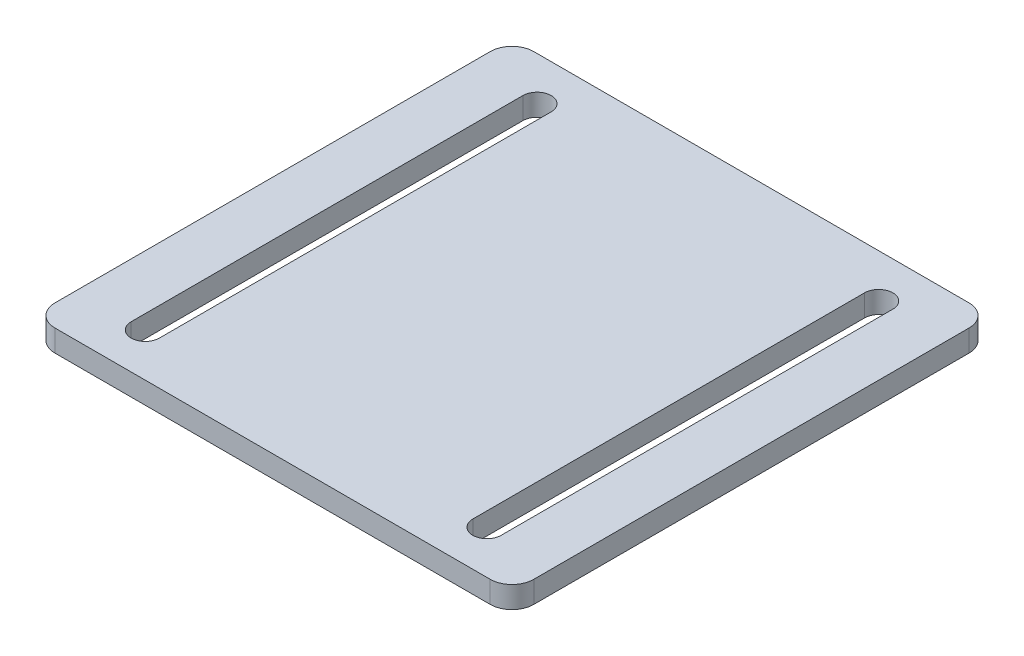
ISO-10303-21;
HEADER;
FILE_DESCRIPTION(('STEP AP214'),'2;1');
FILE_NAME('part.step','',(''),(''),'','','');
FILE_SCHEMA(('AUTOMOTIVE_DESIGN { 1 0 10303 214 1 1 1 1 }'));
ENDSEC;
DATA;
#1=APPLICATION_CONTEXT('core data for automotive mechanical design processes');
#2=APPLICATION_PROTOCOL_DEFINITION('international standard','automotive_design',2000,#1);
#3=PRODUCT_CONTEXT('',#1,'mechanical');
#4=PRODUCT('Part','Part','',(#3));
#5=PRODUCT_RELATED_PRODUCT_CATEGORY('part','',(#4));
#6=PRODUCT_DEFINITION_FORMATION('','',#4);
#7=PRODUCT_DEFINITION_CONTEXT('part definition',#1,'design');
#8=PRODUCT_DEFINITION('design','',#6,#7);
#9=PRODUCT_DEFINITION_SHAPE('','',#8);
#10=(LENGTH_UNIT() NAMED_UNIT(*) SI_UNIT(.MILLI.,.METRE.));
#11=(NAMED_UNIT(*) PLANE_ANGLE_UNIT() SI_UNIT($,.RADIAN.));
#12=(NAMED_UNIT(*) SI_UNIT($,.STERADIAN.) SOLID_ANGLE_UNIT());
#13=UNCERTAINTY_MEASURE_WITH_UNIT(LENGTH_MEASURE(1.E-05),#10,'distance_accuracy_value','');
#14=(GEOMETRIC_REPRESENTATION_CONTEXT(3) GLOBAL_UNCERTAINTY_ASSIGNED_CONTEXT((#13)) GLOBAL_UNIT_ASSIGNED_CONTEXT((#10,
#11,#12)) REPRESENTATION_CONTEXT('',''));
#15=CARTESIAN_POINT('',(0.,0.,0.));
#16=DIRECTION('',(0.,0.,1.));
#17=DIRECTION('',(1.,0.,0.));
#18=AXIS2_PLACEMENT_3D('',#15,#16,#17);
#19=CARTESIAN_POINT('',(-25.4,2.54,-25.4));
#20=DIRECTION('',(0.,-1.,0.));
#21=DIRECTION('',(0.,0.,-1.));
#22=AXIS2_PLACEMENT_3D('',#19,#20,#21);
#23=PLANE('',#22);
#24=CARTESIAN_POINT('',(-19.939,2.54,-22.86));
#25=DIRECTION('',(0.,1.,0.));
#26=DIRECTION('',(0.,0.,1.));
#27=AXIS2_PLACEMENT_3D('',#24,#25,#26);
#28=CIRCLE('',#27,1.651);
#29=CARTESIAN_POINT('',(-18.288,2.54,-22.86));
#30=VERTEX_POINT('',#29);
#31=CARTESIAN_POINT('',(-21.59,2.54,-22.86));
#32=VERTEX_POINT('',#31);
#33=EDGE_CURVE('E182',#30,#32,#28,.T.);
#34=ORIENTED_EDGE('',*,*,#33,.F.);
#35=DIRECTION('',(0.,0.,-1.));
#36=VECTOR('',#35,1.);
#37=CARTESIAN_POINT('',(-18.288,2.54,-22.86));
#38=LINE('',#37,#36);
#39=CARTESIAN_POINT('',(-18.288,2.54,22.86));
#40=VERTEX_POINT('',#39);
#41=EDGE_CURVE('E190',#40,#30,#38,.T.);
#42=ORIENTED_EDGE('',*,*,#41,.F.);
#43=CARTESIAN_POINT('',(-19.939,2.54,22.86));
#44=DIRECTION('',(0.,1.,0.));
#45=DIRECTION('',(0.,0.,1.));
#46=AXIS2_PLACEMENT_3D('',#43,#44,#45);
#47=CIRCLE('',#46,1.651);
#48=CARTESIAN_POINT('',(-21.59,2.54,22.86));
#49=VERTEX_POINT('',#48);
#50=EDGE_CURVE('E187',#49,#40,#47,.T.);
#51=ORIENTED_EDGE('',*,*,#50,.F.);
#52=DIRECTION('',(0.,0.,1.));
#53=VECTOR('',#52,1.);
#54=CARTESIAN_POINT('',(-21.59,2.54,-22.86));
#55=LINE('',#54,#53);
#56=EDGE_CURVE('E184',#32,#49,#55,.T.);
#57=ORIENTED_EDGE('',*,*,#56,.F.);
#58=EDGE_LOOP('',(#34,#42,#51,#57));
#59=FACE_BOUND('',#58,.T.);
#60=DIRECTION('',(0.,0.,1.));
#61=VECTOR('',#60,1.);
#62=CARTESIAN_POINT('',(-27.94,2.54,25.4));
#63=LINE('',#62,#61);
#64=CARTESIAN_POINT('',(-27.94,2.54,-25.4));
#65=VERTEX_POINT('',#64);
#66=CARTESIAN_POINT('',(-27.94,2.54,25.4));
#67=VERTEX_POINT('',#66);
#68=EDGE_CURVE('E213',#65,#67,#63,.T.);
#69=ORIENTED_EDGE('',*,*,#68,.T.);
#70=CARTESIAN_POINT('',(-25.4,2.54,25.4));
#71=DIRECTION('',(0.,1.,0.));
#72=DIRECTION('',(0.,0.,-1.));
#73=AXIS2_PLACEMENT_3D('',#70,#71,#72);
#74=CIRCLE('',#73,2.54);
#75=CARTESIAN_POINT('',(-25.4,2.54,27.94));
#76=VERTEX_POINT('',#75);
#77=EDGE_CURVE('E216',#67,#76,#74,.T.);
#78=ORIENTED_EDGE('',*,*,#77,.T.);
#79=DIRECTION('',(1.,0.,0.));
#80=VECTOR('',#79,1.);
#81=CARTESIAN_POINT('',(0.,2.54,27.94));
#82=LINE('',#81,#80);
#83=CARTESIAN_POINT('',(25.4,2.54,27.94));
#84=VERTEX_POINT('',#83);
#85=EDGE_CURVE('E219',#76,#84,#82,.T.);
#86=ORIENTED_EDGE('',*,*,#85,.T.);
#87=CARTESIAN_POINT('',(25.4,2.54,25.4));
#88=DIRECTION('',(0.,1.,0.));
#89=DIRECTION('',(0.,0.,-1.));
#90=AXIS2_PLACEMENT_3D('',#87,#88,#89);
#91=CIRCLE('',#90,2.54);
#92=CARTESIAN_POINT('',(27.94,2.54,25.4));
#93=VERTEX_POINT('',#92);
#94=EDGE_CURVE('E221',#84,#93,#91,.T.);
#95=ORIENTED_EDGE('',*,*,#94,.T.);
#96=DIRECTION('',(0.,0.,-1.));
#97=VECTOR('',#96,1.);
#98=CARTESIAN_POINT('',(27.94,2.54,0.));
#99=LINE('',#98,#97);
#100=CARTESIAN_POINT('',(27.94,2.54,-25.4));
#101=VERTEX_POINT('',#100);
#102=EDGE_CURVE('E223',#93,#101,#99,.T.);
#103=ORIENTED_EDGE('',*,*,#102,.T.);
#104=CARTESIAN_POINT('',(25.4,2.54,-25.4));
#105=DIRECTION('',(0.,1.,0.));
#106=DIRECTION('',(0.,0.,-1.));
#107=AXIS2_PLACEMENT_3D('',#104,#105,#106);
#108=CIRCLE('',#107,2.54);
#109=CARTESIAN_POINT('',(25.4,2.54,-27.94));
#110=VERTEX_POINT('',#109);
#111=EDGE_CURVE('E225',#101,#110,#108,.T.);
#112=ORIENTED_EDGE('',*,*,#111,.T.);
#113=DIRECTION('',(-1.,0.,0.));
#114=VECTOR('',#113,1.);
#115=CARTESIAN_POINT('',(0.,2.54,-27.94));
#116=LINE('',#115,#114);
#117=CARTESIAN_POINT('',(-25.4,2.54,-27.94));
#118=VERTEX_POINT('',#117);
#119=EDGE_CURVE('E227',#110,#118,#116,.T.);
#120=ORIENTED_EDGE('',*,*,#119,.T.);
#121=CARTESIAN_POINT('',(-25.4,2.54,-25.4));
#122=DIRECTION('',(0.,1.,0.));
#123=DIRECTION('',(0.,0.,-1.));
#124=AXIS2_PLACEMENT_3D('',#121,#122,#123);
#125=CIRCLE('',#124,2.54);
#126=EDGE_CURVE('E229',#118,#65,#125,.T.);
#127=ORIENTED_EDGE('',*,*,#126,.T.);
#128=EDGE_LOOP('',(#69,#78,#86,#95,#103,#112,#120,#127));
#129=FACE_BOUND('',#128,.T.);
#130=CARTESIAN_POINT('',(19.939,2.54,-22.86));
#131=DIRECTION('',(0.,1.,0.));
#132=DIRECTION('',(0.,0.,-1.));
#133=AXIS2_PLACEMENT_3D('',#130,#131,#132);
#134=CIRCLE('',#133,1.651);
#135=CARTESIAN_POINT('',(21.59,2.54,-22.86));
#136=VERTEX_POINT('',#135);
#137=CARTESIAN_POINT('',(18.288,2.54,-22.86));
#138=VERTEX_POINT('',#137);
#139=EDGE_CURVE('E146',#136,#138,#134,.T.);
#140=ORIENTED_EDGE('',*,*,#139,.F.);
#141=DIRECTION('',(0.,0.,-1.));
#142=VECTOR('',#141,1.);
#143=CARTESIAN_POINT('',(21.59,2.54,-22.86));
#144=LINE('',#143,#142);
#145=CARTESIAN_POINT('',(21.59,2.54,22.86));
#146=VERTEX_POINT('',#145);
#147=EDGE_CURVE('E168',#146,#136,#144,.T.);
#148=ORIENTED_EDGE('',*,*,#147,.F.);
#149=CARTESIAN_POINT('',(19.939,2.54,22.86));
#150=DIRECTION('',(0.,1.,0.));
#151=DIRECTION('',(0.,0.,-1.));
#152=AXIS2_PLACEMENT_3D('',#149,#150,#151);
#153=CIRCLE('',#152,1.651);
#154=CARTESIAN_POINT('',(18.288,2.54,22.86));
#155=VERTEX_POINT('',#154);
#156=EDGE_CURVE('E166',#155,#146,#153,.T.);
#157=ORIENTED_EDGE('',*,*,#156,.F.);
#158=DIRECTION('',(0.,0.,1.));
#159=VECTOR('',#158,1.);
#160=CARTESIAN_POINT('',(18.288,2.54,-22.86));
#161=LINE('',#160,#159);
#162=EDGE_CURVE('E154',#138,#155,#161,.T.);
#163=ORIENTED_EDGE('',*,*,#162,.F.);
#164=EDGE_LOOP('',(#140,#148,#157,#163));
#165=FACE_BOUND('',#164,.T.);
#166=ADVANCED_FACE('F33',(#59,#129,#165),#23,.F.);
#167=CARTESIAN_POINT('',(-25.4,0.,-25.4));
#168=DIRECTION('',(0.,-1.,0.));
#169=DIRECTION('',(0.,0.,-1.));
#170=AXIS2_PLACEMENT_3D('',#167,#168,#169);
#171=PLANE('',#170);
#172=DIRECTION('',(0.,0.,-1.));
#173=VECTOR('',#172,1.);
#174=CARTESIAN_POINT('',(-18.288,0.,-22.86));
#175=LINE('',#174,#173);
#176=CARTESIAN_POINT('',(-18.288,0.,22.86));
#177=VERTEX_POINT('',#176);
#178=CARTESIAN_POINT('',(-18.288,0.,-22.86));
#179=VERTEX_POINT('',#178);
#180=EDGE_CURVE('E185',#177,#179,#175,.T.);
#181=ORIENTED_EDGE('',*,*,#180,.T.);
#182=CARTESIAN_POINT('',(-19.939,0.,-22.86));
#183=DIRECTION('',(0.,1.,0.));
#184=DIRECTION('',(0.,0.,1.));
#185=AXIS2_PLACEMENT_3D('',#182,#183,#184);
#186=CIRCLE('',#185,1.651);
#187=CARTESIAN_POINT('',(-21.59,0.,-22.86));
#188=VERTEX_POINT('',#187);
#189=EDGE_CURVE('E162',#179,#188,#186,.T.);
#190=ORIENTED_EDGE('',*,*,#189,.T.);
#191=DIRECTION('',(0.,0.,1.));
#192=VECTOR('',#191,1.);
#193=CARTESIAN_POINT('',(-21.59,0.,-22.86));
#194=LINE('',#193,#192);
#195=CARTESIAN_POINT('',(-21.59,0.,22.86));
#196=VERTEX_POINT('',#195);
#197=EDGE_CURVE('E195',#188,#196,#194,.T.);
#198=ORIENTED_EDGE('',*,*,#197,.T.);
#199=CARTESIAN_POINT('',(-19.939,0.,22.86));
#200=DIRECTION('',(0.,1.,0.));
#201=DIRECTION('',(0.,0.,1.));
#202=AXIS2_PLACEMENT_3D('',#199,#200,#201);
#203=CIRCLE('',#202,1.651);
#204=EDGE_CURVE('E198',#196,#177,#203,.T.);
#205=ORIENTED_EDGE('',*,*,#204,.T.);
#206=EDGE_LOOP('',(#181,#190,#198,#205));
#207=FACE_BOUND('',#206,.T.);
#208=CARTESIAN_POINT('',(-25.4,0.,25.4));
#209=DIRECTION('',(0.,1.,0.));
#210=DIRECTION('',(0.,0.,-1.));
#211=AXIS2_PLACEMENT_3D('',#208,#209,#210);
#212=CIRCLE('',#211,2.54);
#213=CARTESIAN_POINT('',(-27.94,0.,25.4));
#214=VERTEX_POINT('',#213);
#215=CARTESIAN_POINT('',(-25.4,0.,27.94));
#216=VERTEX_POINT('',#215);
#217=EDGE_CURVE('E212',#214,#216,#212,.T.);
#218=ORIENTED_EDGE('',*,*,#217,.F.);
#219=DIRECTION('',(0.,0.,1.));
#220=VECTOR('',#219,1.);
#221=CARTESIAN_POINT('',(-27.94,0.,0.));
#222=LINE('',#221,#220);
#223=CARTESIAN_POINT('',(-27.94,0.,-25.4));
#224=VERTEX_POINT('',#223);
#225=EDGE_CURVE('E217',#224,#214,#222,.T.);
#226=ORIENTED_EDGE('',*,*,#225,.F.);
#227=CARTESIAN_POINT('',(-25.4,0.,-25.4));
#228=DIRECTION('',(0.,1.,0.));
#229=DIRECTION('',(0.,0.,-1.));
#230=AXIS2_PLACEMENT_3D('',#227,#228,#229);
#231=CIRCLE('',#230,2.54);
#232=CARTESIAN_POINT('',(-25.4,0.,-27.94));
#233=VERTEX_POINT('',#232);
#234=EDGE_CURVE('E247',#233,#224,#231,.T.);
#235=ORIENTED_EDGE('',*,*,#234,.F.);
#236=DIRECTION('',(-1.,0.,0.));
#237=VECTOR('',#236,1.);
#238=CARTESIAN_POINT('',(-25.4,0.,-27.94));
#239=LINE('',#238,#237);
#240=CARTESIAN_POINT('',(25.4,0.,-27.94));
#241=VERTEX_POINT('',#240);
#242=EDGE_CURVE('E245',#241,#233,#239,.T.);
#243=ORIENTED_EDGE('',*,*,#242,.F.);
#244=CARTESIAN_POINT('',(25.4,0.,-25.4));
#245=DIRECTION('',(0.,1.,0.));
#246=DIRECTION('',(0.,0.,-1.));
#247=AXIS2_PLACEMENT_3D('',#244,#245,#246);
#248=CIRCLE('',#247,2.54);
#249=CARTESIAN_POINT('',(27.94,0.,-25.4));
#250=VERTEX_POINT('',#249);
#251=EDGE_CURVE('E242',#250,#241,#248,.T.);
#252=ORIENTED_EDGE('',*,*,#251,.F.);
#253=DIRECTION('',(0.,0.,-1.));
#254=VECTOR('',#253,1.);
#255=CARTESIAN_POINT('',(27.94,0.,-25.4));
#256=LINE('',#255,#254);
#257=CARTESIAN_POINT('',(27.94,0.,25.4));
#258=VERTEX_POINT('',#257);
#259=EDGE_CURVE('E240',#258,#250,#256,.T.);
#260=ORIENTED_EDGE('',*,*,#259,.F.);
#261=CARTESIAN_POINT('',(25.4,0.,25.4));
#262=DIRECTION('',(0.,1.,0.));
#263=DIRECTION('',(0.,0.,-1.));
#264=AXIS2_PLACEMENT_3D('',#261,#262,#263);
#265=CIRCLE('',#264,2.54);
#266=CARTESIAN_POINT('',(25.4,0.,27.94));
#267=VERTEX_POINT('',#266);
#268=EDGE_CURVE('E237',#267,#258,#265,.T.);
#269=ORIENTED_EDGE('',*,*,#268,.F.);
#270=DIRECTION('',(1.,0.,0.));
#271=VECTOR('',#270,1.);
#272=CARTESIAN_POINT('',(25.4,0.,27.94));
#273=LINE('',#272,#271);
#274=EDGE_CURVE('E235',#216,#267,#273,.T.);
#275=ORIENTED_EDGE('',*,*,#274,.F.);
#276=EDGE_LOOP('',(#218,#226,#235,#243,#252,#260,#269,#275));
#277=FACE_BOUND('',#276,.T.);
#278=DIRECTION('',(0.,0.,-1.));
#279=VECTOR('',#278,1.);
#280=CARTESIAN_POINT('',(21.59,0.,-22.86));
#281=LINE('',#280,#279);
#282=CARTESIAN_POINT('',(21.59,0.,22.86));
#283=VERTEX_POINT('',#282);
#284=CARTESIAN_POINT('',(21.59,0.,-22.86));
#285=VERTEX_POINT('',#284);
#286=EDGE_CURVE('E155',#283,#285,#281,.T.);
#287=ORIENTED_EDGE('',*,*,#286,.T.);
#288=CARTESIAN_POINT('',(19.939,0.,-22.86));
#289=DIRECTION('',(0.,1.,0.));
#290=DIRECTION('',(0.,0.,-1.));
#291=AXIS2_PLACEMENT_3D('',#288,#289,#290);
#292=CIRCLE('',#291,1.651);
#293=CARTESIAN_POINT('',(18.288,0.,-22.86));
#294=VERTEX_POINT('',#293);
#295=EDGE_CURVE('E56',#285,#294,#292,.T.);
#296=ORIENTED_EDGE('',*,*,#295,.T.);
#297=DIRECTION('',(0.,0.,1.));
#298=VECTOR('',#297,1.);
#299=CARTESIAN_POINT('',(18.288,0.,-22.86));
#300=LINE('',#299,#298);
#301=CARTESIAN_POINT('',(18.288,0.,22.86));
#302=VERTEX_POINT('',#301);
#303=EDGE_CURVE('E161',#294,#302,#300,.T.);
#304=ORIENTED_EDGE('',*,*,#303,.T.);
#305=CARTESIAN_POINT('',(19.939,0.,22.86));
#306=DIRECTION('',(0.,1.,0.));
#307=DIRECTION('',(0.,0.,-1.));
#308=AXIS2_PLACEMENT_3D('',#305,#306,#307);
#309=CIRCLE('',#308,1.651);
#310=EDGE_CURVE('E174',#302,#283,#309,.T.);
#311=ORIENTED_EDGE('',*,*,#310,.T.);
#312=EDGE_LOOP('',(#287,#296,#304,#311));
#313=FACE_BOUND('',#312,.T.);
#314=ADVANCED_FACE('F277',(#207,#277,#313),#171,.T.);
#315=CARTESIAN_POINT('',(-25.4,2.54,25.4));
#316=DIRECTION('',(0.,-1.,0.));
#317=DIRECTION('',(0.,0.,-1.));
#318=AXIS2_PLACEMENT_3D('',#315,#316,#317);
#319=CYLINDRICAL_SURFACE('',#318,2.54);
#320=ORIENTED_EDGE('',*,*,#217,.T.);
#321=DIRECTION('',(0.,-1.,0.));
#322=VECTOR('',#321,1.);
#323=CARTESIAN_POINT('',(-25.4,2.54,27.94));
#324=LINE('',#323,#322);
#325=EDGE_CURVE('E41',#76,#216,#324,.T.);
#326=ORIENTED_EDGE('',*,*,#325,.F.);
#327=ORIENTED_EDGE('',*,*,#77,.F.);
#328=DIRECTION('',(0.,-1.,0.));
#329=VECTOR('',#328,1.);
#330=CARTESIAN_POINT('',(-27.94,2.54,25.4));
#331=LINE('',#330,#329);
#332=EDGE_CURVE('E11',#67,#214,#331,.T.);
#333=ORIENTED_EDGE('',*,*,#332,.T.);
#334=EDGE_LOOP('',(#320,#326,#327,#333));
#335=FACE_BOUND('',#334,.T.);
#336=ADVANCED_FACE('F35',(#335),#319,.T.);
#337=CARTESIAN_POINT('',(25.4,2.54,27.94));
#338=DIRECTION('',(0.,0.,-1.));
#339=DIRECTION('',(-1.,0.,0.));
#340=AXIS2_PLACEMENT_3D('',#337,#338,#339);
#341=PLANE('',#340);
#342=ORIENTED_EDGE('',*,*,#274,.T.);
#343=DIRECTION('',(0.,-1.,0.));
#344=VECTOR('',#343,1.);
#345=CARTESIAN_POINT('',(25.4,2.54,27.94));
#346=LINE('',#345,#344);
#347=EDGE_CURVE('E264',#84,#267,#346,.T.);
#348=ORIENTED_EDGE('',*,*,#347,.F.);
#349=ORIENTED_EDGE('',*,*,#85,.F.);
#350=ORIENTED_EDGE('',*,*,#325,.T.);
#351=EDGE_LOOP('',(#342,#348,#349,#350));
#352=FACE_BOUND('',#351,.T.);
#353=ADVANCED_FACE('F270',(#352),#341,.F.);
#354=CARTESIAN_POINT('',(25.4,2.54,25.4));
#355=DIRECTION('',(0.,-1.,0.));
#356=DIRECTION('',(0.,0.,-1.));
#357=AXIS2_PLACEMENT_3D('',#354,#355,#356);
#358=CYLINDRICAL_SURFACE('',#357,2.54);
#359=ORIENTED_EDGE('',*,*,#268,.T.);
#360=DIRECTION('',(0.,-1.,0.));
#361=VECTOR('',#360,1.);
#362=CARTESIAN_POINT('',(27.94,2.54,25.4));
#363=LINE('',#362,#361);
#364=EDGE_CURVE('E261',#93,#258,#363,.T.);
#365=ORIENTED_EDGE('',*,*,#364,.F.);
#366=ORIENTED_EDGE('',*,*,#94,.F.);
#367=ORIENTED_EDGE('',*,*,#347,.T.);
#368=EDGE_LOOP('',(#359,#365,#366,#367));
#369=FACE_BOUND('',#368,.T.);
#370=ADVANCED_FACE('F284',(#369),#358,.T.);
#371=CARTESIAN_POINT('',(27.94,2.54,-25.4));
#372=DIRECTION('',(-1.,0.,0.));
#373=DIRECTION('',(0.,0.,1.));
#374=AXIS2_PLACEMENT_3D('',#371,#372,#373);
#375=PLANE('',#374);
#376=ORIENTED_EDGE('',*,*,#259,.T.);
#377=DIRECTION('',(0.,-1.,0.));
#378=VECTOR('',#377,1.);
#379=CARTESIAN_POINT('',(27.94,2.54,-25.4));
#380=LINE('',#379,#378);
#381=EDGE_CURVE('E258',#101,#250,#380,.T.);
#382=ORIENTED_EDGE('',*,*,#381,.F.);
#383=ORIENTED_EDGE('',*,*,#102,.F.);
#384=ORIENTED_EDGE('',*,*,#364,.T.);
#385=EDGE_LOOP('',(#376,#382,#383,#384));
#386=FACE_BOUND('',#385,.T.);
#387=ADVANCED_FACE('F288',(#386),#375,.F.);
#388=CARTESIAN_POINT('',(25.4,2.54,-25.4));
#389=DIRECTION('',(0.,-1.,0.));
#390=DIRECTION('',(0.,0.,-1.));
#391=AXIS2_PLACEMENT_3D('',#388,#389,#390);
#392=CYLINDRICAL_SURFACE('',#391,2.54);
#393=ORIENTED_EDGE('',*,*,#251,.T.);
#394=DIRECTION('',(0.,-1.,0.));
#395=VECTOR('',#394,1.);
#396=CARTESIAN_POINT('',(25.4,2.54,-27.94));
#397=LINE('',#396,#395);
#398=EDGE_CURVE('E255',#110,#241,#397,.T.);
#399=ORIENTED_EDGE('',*,*,#398,.F.);
#400=ORIENTED_EDGE('',*,*,#111,.F.);
#401=ORIENTED_EDGE('',*,*,#381,.T.);
#402=EDGE_LOOP('',(#393,#399,#400,#401));
#403=FACE_BOUND('',#402,.T.);
#404=ADVANCED_FACE('F302',(#403),#392,.T.);
#405=CARTESIAN_POINT('',(-25.4,2.54,-27.94));
#406=DIRECTION('',(0.,0.,1.));
#407=DIRECTION('',(1.,0.,0.));
#408=AXIS2_PLACEMENT_3D('',#405,#406,#407);
#409=PLANE('',#408);
#410=ORIENTED_EDGE('',*,*,#242,.T.);
#411=DIRECTION('',(0.,-1.,0.));
#412=VECTOR('',#411,1.);
#413=CARTESIAN_POINT('',(-25.4,2.54,-27.94));
#414=LINE('',#413,#412);
#415=EDGE_CURVE('E252',#118,#233,#414,.T.);
#416=ORIENTED_EDGE('',*,*,#415,.F.);
#417=ORIENTED_EDGE('',*,*,#119,.F.);
#418=ORIENTED_EDGE('',*,*,#398,.T.);
#419=EDGE_LOOP('',(#410,#416,#417,#418));
#420=FACE_BOUND('',#419,.T.);
#421=ADVANCED_FACE('F304',(#420),#409,.F.);
#422=CARTESIAN_POINT('',(-25.4,2.54,-25.4));
#423=DIRECTION('',(0.,-1.,0.));
#424=DIRECTION('',(0.,0.,-1.));
#425=AXIS2_PLACEMENT_3D('',#422,#423,#424);
#426=CYLINDRICAL_SURFACE('',#425,2.54);
#427=ORIENTED_EDGE('',*,*,#234,.T.);
#428=DIRECTION('',(0.,-1.,0.));
#429=VECTOR('',#428,1.);
#430=CARTESIAN_POINT('',(-27.94,2.54,-25.4));
#431=LINE('',#430,#429);
#432=EDGE_CURVE('E232',#65,#224,#431,.T.);
#433=ORIENTED_EDGE('',*,*,#432,.F.);
#434=ORIENTED_EDGE('',*,*,#126,.F.);
#435=ORIENTED_EDGE('',*,*,#415,.T.);
#436=EDGE_LOOP('',(#427,#433,#434,#435));
#437=FACE_BOUND('',#436,.T.);
#438=ADVANCED_FACE('F298',(#437),#426,.T.);
#439=CARTESIAN_POINT('',(-27.94,2.54,0.));
#440=DIRECTION('',(1.,0.,0.));
#441=DIRECTION('',(0.,0.,-1.));
#442=AXIS2_PLACEMENT_3D('',#439,#440,#441);
#443=PLANE('',#442);
#444=ORIENTED_EDGE('',*,*,#225,.T.);
#445=ORIENTED_EDGE('',*,*,#332,.F.);
#446=ORIENTED_EDGE('',*,*,#68,.F.);
#447=ORIENTED_EDGE('',*,*,#432,.T.);
#448=EDGE_LOOP('',(#444,#445,#446,#447));
#449=FACE_BOUND('',#448,.T.);
#450=ADVANCED_FACE('F296',(#449),#443,.F.);
#451=CARTESIAN_POINT('',(-19.939,2.54,-22.86));
#452=DIRECTION('',(0.,-1.,0.));
#453=DIRECTION('',(0.,0.,-1.));
#454=AXIS2_PLACEMENT_3D('',#451,#452,#453);
#455=CYLINDRICAL_SURFACE('',#454,1.651);
#456=ORIENTED_EDGE('',*,*,#189,.F.);
#457=DIRECTION('',(0.,-1.,0.));
#458=VECTOR('',#457,1.);
#459=CARTESIAN_POINT('',(-18.288,2.54,-22.86));
#460=LINE('',#459,#458);
#461=EDGE_CURVE('E192',#30,#179,#460,.T.);
#462=ORIENTED_EDGE('',*,*,#461,.F.);
#463=ORIENTED_EDGE('',*,*,#33,.T.);
#464=DIRECTION('',(0.,-1.,0.));
#465=VECTOR('',#464,1.);
#466=CARTESIAN_POINT('',(-21.59,2.54,-22.86));
#467=LINE('',#466,#465);
#468=EDGE_CURVE('E209',#32,#188,#467,.T.);
#469=ORIENTED_EDGE('',*,*,#468,.T.);
#470=EDGE_LOOP('',(#456,#462,#463,#469));
#471=FACE_BOUND('',#470,.T.);
#472=ADVANCED_FACE('F323',(#471),#455,.F.);
#473=CARTESIAN_POINT('',(-21.59,2.54,-22.86));
#474=DIRECTION('',(1.,0.,0.));
#475=DIRECTION('',(0.,0.,-1.));
#476=AXIS2_PLACEMENT_3D('',#473,#474,#475);
#477=PLANE('',#476);
#478=ORIENTED_EDGE('',*,*,#197,.F.);
#479=ORIENTED_EDGE('',*,*,#468,.F.);
#480=ORIENTED_EDGE('',*,*,#56,.T.);
#481=DIRECTION('',(0.,-1.,0.));
#482=VECTOR('',#481,1.);
#483=CARTESIAN_POINT('',(-21.59,2.54,22.86));
#484=LINE('',#483,#482);
#485=EDGE_CURVE('E207',#49,#196,#484,.T.);
#486=ORIENTED_EDGE('',*,*,#485,.T.);
#487=EDGE_LOOP('',(#478,#479,#480,#486));
#488=FACE_BOUND('',#487,.T.);
#489=ADVANCED_FACE('F330',(#488),#477,.T.);
#490=CARTESIAN_POINT('',(-19.939,2.54,22.86));
#491=DIRECTION('',(0.,-1.,0.));
#492=DIRECTION('',(0.,0.,-1.));
#493=AXIS2_PLACEMENT_3D('',#490,#491,#492);
#494=CYLINDRICAL_SURFACE('',#493,1.651);
#495=ORIENTED_EDGE('',*,*,#204,.F.);
#496=ORIENTED_EDGE('',*,*,#485,.F.);
#497=ORIENTED_EDGE('',*,*,#50,.T.);
#498=DIRECTION('',(0.,-1.,0.));
#499=VECTOR('',#498,1.);
#500=CARTESIAN_POINT('',(-18.288,2.54,22.86));
#501=LINE('',#500,#499);
#502=EDGE_CURVE('E205',#40,#177,#501,.T.);
#503=ORIENTED_EDGE('',*,*,#502,.T.);
#504=EDGE_LOOP('',(#495,#496,#497,#503));
#505=FACE_BOUND('',#504,.T.);
#506=ADVANCED_FACE('F335',(#505),#494,.F.);
#507=CARTESIAN_POINT('',(-18.288,2.54,-22.86));
#508=DIRECTION('',(-1.,0.,0.));
#509=DIRECTION('',(0.,0.,1.));
#510=AXIS2_PLACEMENT_3D('',#507,#508,#509);
#511=PLANE('',#510);
#512=ORIENTED_EDGE('',*,*,#180,.F.);
#513=ORIENTED_EDGE('',*,*,#502,.F.);
#514=ORIENTED_EDGE('',*,*,#41,.T.);
#515=ORIENTED_EDGE('',*,*,#461,.T.);
#516=EDGE_LOOP('',(#512,#513,#514,#515));
#517=FACE_BOUND('',#516,.T.);
#518=ADVANCED_FACE('F341',(#517),#511,.T.);
#519=CARTESIAN_POINT('',(19.939,2.54,-22.86));
#520=DIRECTION('',(0.,-1.,0.));
#521=DIRECTION('',(0.,0.,-1.));
#522=AXIS2_PLACEMENT_3D('',#519,#520,#521);
#523=CYLINDRICAL_SURFACE('',#522,1.651);
#524=ORIENTED_EDGE('',*,*,#295,.F.);
#525=DIRECTION('',(0.,-1.,0.));
#526=VECTOR('',#525,1.);
#527=CARTESIAN_POINT('',(21.59,2.54,-22.86));
#528=LINE('',#527,#526);
#529=EDGE_CURVE('E150',#136,#285,#528,.T.);
#530=ORIENTED_EDGE('',*,*,#529,.F.);
#531=ORIENTED_EDGE('',*,*,#139,.T.);
#532=DIRECTION('',(0.,-1.,0.));
#533=VECTOR('',#532,1.);
#534=CARTESIAN_POINT('',(18.288,2.54,-22.86));
#535=LINE('',#534,#533);
#536=EDGE_CURVE('E149',#138,#294,#535,.T.);
#537=ORIENTED_EDGE('',*,*,#536,.T.);
#538=EDGE_LOOP('',(#524,#530,#531,#537));
#539=FACE_BOUND('',#538,.T.);
#540=ADVANCED_FACE('F148',(#539),#523,.F.);
#541=CARTESIAN_POINT('',(18.288,2.54,-22.86));
#542=DIRECTION('',(1.,0.,0.));
#543=DIRECTION('',(0.,0.,-1.));
#544=AXIS2_PLACEMENT_3D('',#541,#542,#543);
#545=PLANE('',#544);
#546=ORIENTED_EDGE('',*,*,#303,.F.);
#547=ORIENTED_EDGE('',*,*,#536,.F.);
#548=ORIENTED_EDGE('',*,*,#162,.T.);
#549=DIRECTION('',(0.,-1.,0.));
#550=VECTOR('',#549,1.);
#551=CARTESIAN_POINT('',(18.288,2.54,22.86));
#552=LINE('',#551,#550);
#553=EDGE_CURVE('E163',#155,#302,#552,.T.);
#554=ORIENTED_EDGE('',*,*,#553,.T.);
#555=EDGE_LOOP('',(#546,#547,#548,#554));
#556=FACE_BOUND('',#555,.T.);
#557=ADVANCED_FACE('F158',(#556),#545,.T.);
#558=CARTESIAN_POINT('',(19.939,2.54,22.86));
#559=DIRECTION('',(0.,-1.,0.));
#560=DIRECTION('',(0.,0.,-1.));
#561=AXIS2_PLACEMENT_3D('',#558,#559,#560);
#562=CYLINDRICAL_SURFACE('',#561,1.651);
#563=ORIENTED_EDGE('',*,*,#310,.F.);
#564=ORIENTED_EDGE('',*,*,#553,.F.);
#565=ORIENTED_EDGE('',*,*,#156,.T.);
#566=DIRECTION('',(0.,-1.,0.));
#567=VECTOR('',#566,1.);
#568=CARTESIAN_POINT('',(21.59,2.54,22.86));
#569=LINE('',#568,#567);
#570=EDGE_CURVE('E48',#146,#283,#569,.T.);
#571=ORIENTED_EDGE('',*,*,#570,.T.);
#572=EDGE_LOOP('',(#563,#564,#565,#571));
#573=FACE_BOUND('',#572,.T.);
#574=ADVANCED_FACE('F359',(#573),#562,.F.);
#575=CARTESIAN_POINT('',(21.59,2.54,-22.86));
#576=DIRECTION('',(-1.,0.,0.));
#577=DIRECTION('',(0.,0.,1.));
#578=AXIS2_PLACEMENT_3D('',#575,#576,#577);
#579=PLANE('',#578);
#580=ORIENTED_EDGE('',*,*,#286,.F.);
#581=ORIENTED_EDGE('',*,*,#570,.F.);
#582=ORIENTED_EDGE('',*,*,#147,.T.);
#583=ORIENTED_EDGE('',*,*,#529,.T.);
#584=EDGE_LOOP('',(#580,#581,#582,#583));
#585=FACE_BOUND('',#584,.T.);
#586=ADVANCED_FACE('F362',(#585),#579,.T.);
#587=CLOSED_SHELL('',(#166,#314,#336,#353,#370,#387,#404,#421,#438,#450,#472,#489,#506,#518,
#540,#557,#574,#586));
#588=MANIFOLD_SOLID_BREP('B2',#587);
#589=ADVANCED_BREP_SHAPE_REPRESENTATION('',(#18,#588),#14);
#590=SHAPE_DEFINITION_REPRESENTATION(#9,#589);
ENDSEC;
END-ISO-10303-21;
